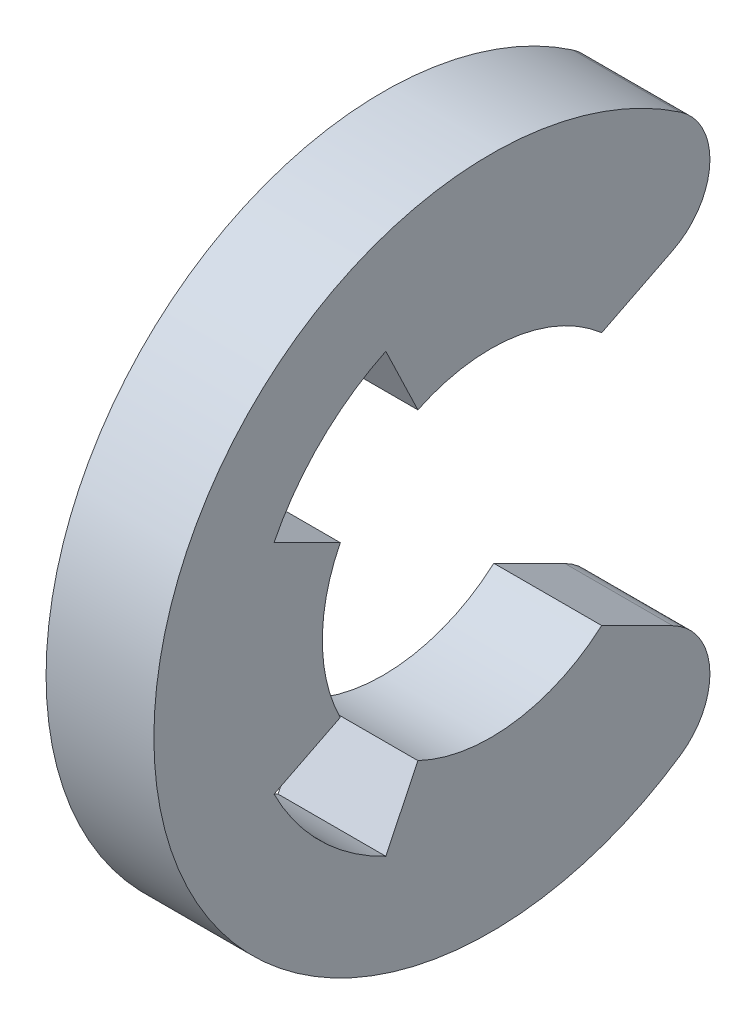
ISO-10303-21;
HEADER;
FILE_DESCRIPTION(('STEP AP214'),'2;1');
FILE_NAME('part.step','',(''),(''),'','','');
FILE_SCHEMA(('AUTOMOTIVE_DESIGN { 1 0 10303 214 1 1 1 1 }'));
ENDSEC;
DATA;
#1=APPLICATION_CONTEXT('core data for automotive mechanical design processes');
#2=APPLICATION_PROTOCOL_DEFINITION('international standard','automotive_design',2000,#1);
#3=PRODUCT_CONTEXT('',#1,'mechanical');
#4=PRODUCT('Part','Part','',(#3));
#5=PRODUCT_RELATED_PRODUCT_CATEGORY('part','',(#4));
#6=PRODUCT_DEFINITION_FORMATION('','',#4);
#7=PRODUCT_DEFINITION_CONTEXT('part definition',#1,'design');
#8=PRODUCT_DEFINITION('design','',#6,#7);
#9=PRODUCT_DEFINITION_SHAPE('','',#8);
#10=(LENGTH_UNIT() NAMED_UNIT(*) SI_UNIT(.MILLI.,.METRE.));
#11=(NAMED_UNIT(*) PLANE_ANGLE_UNIT() SI_UNIT($,.RADIAN.));
#12=(NAMED_UNIT(*) SI_UNIT($,.STERADIAN.) SOLID_ANGLE_UNIT());
#13=UNCERTAINTY_MEASURE_WITH_UNIT(LENGTH_MEASURE(1.E-05),#10,'distance_accuracy_value','');
#14=(GEOMETRIC_REPRESENTATION_CONTEXT(3) GLOBAL_UNCERTAINTY_ASSIGNED_CONTEXT((#13)) GLOBAL_UNIT_ASSIGNED_CONTEXT((#10,
#11,#12)) REPRESENTATION_CONTEXT('',''));
#15=CARTESIAN_POINT('',(0.,0.,0.));
#16=DIRECTION('',(0.,0.,1.));
#17=DIRECTION('',(1.,0.,0.));
#18=AXIS2_PLACEMENT_3D('',#15,#16,#17);
#19=CARTESIAN_POINT('',(0.8,0.,0.));
#20=DIRECTION('',(-1.,0.,0.));
#21=DIRECTION('',(0.,0.,1.));
#22=AXIS2_PLACEMENT_3D('',#19,#20,#21);
#23=CYLINDRICAL_SURFACE('',#22,1.25);
#24=CARTESIAN_POINT('',(0.,0.,0.));
#25=DIRECTION('',(-1.,0.,0.));
#26=DIRECTION('',(0.,0.,-1.));
#27=AXIS2_PLACEMENT_3D('',#24,#25,#26);
#28=CIRCLE('',#27,1.25);
#29=CARTESIAN_POINT('',(0.,-0.940873030296505,-0.822956828066134));
#30=VERTEX_POINT('',#29);
#31=CARTESIAN_POINT('',(0.,-1.12692770086044,0.54086408369701));
#32=VERTEX_POINT('',#31);
#33=EDGE_CURVE('E166',#30,#32,#28,.T.);
#34=ORIENTED_EDGE('',*,*,#33,.T.);
#35=DIRECTION('',(-1.,0.,0.));
#36=VECTOR('',#35,1.);
#37=CARTESIAN_POINT('',(0.8,-1.12692770086044,0.54086408369701));
#38=LINE('',#37,#36);
#39=CARTESIAN_POINT('',(0.8,-1.12692770086044,0.54086408369701));
#40=VERTEX_POINT('',#39);
#41=EDGE_CURVE('E149',#40,#32,#38,.T.);
#42=ORIENTED_EDGE('',*,*,#41,.F.);
#43=CARTESIAN_POINT('',(0.8,0.,0.));
#44=DIRECTION('',(-1.,0.,0.));
#45=DIRECTION('',(0.,0.,-1.));
#46=AXIS2_PLACEMENT_3D('',#43,#44,#45);
#47=CIRCLE('',#46,1.25);
#48=CARTESIAN_POINT('',(0.8,-0.940873030296505,-0.822956828066134));
#49=VERTEX_POINT('',#48);
#50=EDGE_CURVE('E155',#49,#40,#47,.T.);
#51=ORIENTED_EDGE('',*,*,#50,.F.);
#52=DIRECTION('',(-1.,0.,0.));
#53=VECTOR('',#52,1.);
#54=CARTESIAN_POINT('',(0.8,-0.940873030296505,-0.822956828066134));
#55=LINE('',#54,#53);
#56=EDGE_CURVE('E213',#49,#30,#55,.T.);
#57=ORIENTED_EDGE('',*,*,#56,.T.);
#58=EDGE_LOOP('',(#34,#42,#51,#57));
#59=FACE_BOUND('',#58,.T.);
#60=ADVANCED_FACE('F41',(#59),#23,.F.);
#61=CARTESIAN_POINT('',(0.8,-1.12692770086044,0.54086408369701));
#62=DIRECTION('',(0.,-0.432691266957608,-0.901542160688351));
#63=DIRECTION('',(0.,0.901542160688351,-0.432691266957608));
#64=AXIS2_PLACEMENT_3D('',#61,#62,#63);
#65=PLANE('',#64);
#66=DIRECTION('',(0.,-0.901542160688351,0.432691266957608));
#67=VECTOR('',#66,1.);
#68=CARTESIAN_POINT('',(0.,-1.12692770086044,0.54086408369701));
#69=LINE('',#68,#67);
#70=CARTESIAN_POINT('',(0.,-1.62277588923903,0.778844280523694));
#71=VERTEX_POINT('',#70);
#72=EDGE_CURVE('E248',#32,#71,#69,.T.);
#73=ORIENTED_EDGE('',*,*,#72,.T.);
#74=DIRECTION('',(-1.,0.,0.));
#75=VECTOR('',#74,1.);
#76=CARTESIAN_POINT('',(0.8,-1.62277588923903,0.778844280523694));
#77=LINE('',#76,#75);
#78=CARTESIAN_POINT('',(0.8,-1.62277588923903,0.778844280523694));
#79=VERTEX_POINT('',#78);
#80=EDGE_CURVE('E152',#79,#71,#77,.T.);
#81=ORIENTED_EDGE('',*,*,#80,.F.);
#82=DIRECTION('',(0.,-0.901542160688351,0.432691266957608));
#83=VECTOR('',#82,1.);
#84=CARTESIAN_POINT('',(0.8,-1.12692770086044,0.54086408369701));
#85=LINE('',#84,#83);
#86=EDGE_CURVE('E145',#40,#79,#85,.T.);
#87=ORIENTED_EDGE('',*,*,#86,.F.);
#88=ORIENTED_EDGE('',*,*,#41,.T.);
#89=EDGE_LOOP('',(#73,#81,#87,#88));
#90=FACE_BOUND('',#89,.T.);
#91=ADVANCED_FACE('F147',(#90),#65,.F.);
#92=CARTESIAN_POINT('',(0.8,0.,0.));
#93=DIRECTION('',(-1.,0.,0.));
#94=DIRECTION('',(0.,0.,1.));
#95=AXIS2_PLACEMENT_3D('',#92,#93,#94);
#96=CYLINDRICAL_SURFACE('',#95,1.8);
#97=CARTESIAN_POINT('',(0.,0.,0.));
#98=DIRECTION('',(-1.,0.,0.));
#99=DIRECTION('',(0.,0.,1.));
#100=AXIS2_PLACEMENT_3D('',#97,#98,#99);
#101=CIRCLE('',#100,1.8);
#102=CARTESIAN_POINT('',(0.,-0.808758973686157,1.60807615568483));
#103=VERTEX_POINT('',#102);
#104=EDGE_CURVE('E242',#71,#103,#101,.T.);
#105=ORIENTED_EDGE('',*,*,#104,.T.);
#106=DIRECTION('',(-1.,0.,0.));
#107=VECTOR('',#106,1.);
#108=CARTESIAN_POINT('',(0.8,-0.808758973686157,1.60807615568483));
#109=LINE('',#108,#107);
#110=CARTESIAN_POINT('',(0.8,-0.808758973686157,1.60807615568483));
#111=VERTEX_POINT('',#110);
#112=EDGE_CURVE('E171',#111,#103,#109,.T.);
#113=ORIENTED_EDGE('',*,*,#112,.F.);
#114=CARTESIAN_POINT('',(0.8,0.,0.));
#115=DIRECTION('',(-1.,0.,0.));
#116=DIRECTION('',(0.,0.,1.));
#117=AXIS2_PLACEMENT_3D('',#114,#115,#116);
#118=CIRCLE('',#117,1.8);
#119=EDGE_CURVE('E154',#79,#111,#118,.T.);
#120=ORIENTED_EDGE('',*,*,#119,.F.);
#121=ORIENTED_EDGE('',*,*,#80,.T.);
#122=EDGE_LOOP('',(#105,#113,#120,#121));
#123=FACE_BOUND('',#122,.T.);
#124=ADVANCED_FACE('F273',(#123),#96,.F.);
#125=CARTESIAN_POINT('',(0.8,-0.561638176170942,1.11671955255891));
#126=DIRECTION('',(0.,0.89337564204713,0.449310540936753));
#127=DIRECTION('',(0.,-0.449310540936753,0.89337564204713));
#128=AXIS2_PLACEMENT_3D('',#125,#126,#127);
#129=PLANE('',#128);
#130=DIRECTION('',(0.,0.449310540936753,-0.89337564204713));
#131=VECTOR('',#130,1.);
#132=CARTESIAN_POINT('',(0.,-0.561638176170942,1.11671955255891));
#133=LINE('',#132,#131);
#134=CARTESIAN_POINT('',(0.,-0.561638176170942,1.11671955255891));
#135=VERTEX_POINT('',#134);
#136=EDGE_CURVE('E237',#103,#135,#133,.T.);
#137=ORIENTED_EDGE('',*,*,#136,.T.);
#138=DIRECTION('',(-1.,0.,0.));
#139=VECTOR('',#138,1.);
#140=CARTESIAN_POINT('',(0.8,-0.561638176170942,1.11671955255891));
#141=LINE('',#140,#139);
#142=CARTESIAN_POINT('',(0.8,-0.561638176170942,1.11671955255891));
#143=VERTEX_POINT('',#142);
#144=EDGE_CURVE('E228',#143,#135,#141,.T.);
#145=ORIENTED_EDGE('',*,*,#144,.F.);
#146=DIRECTION('',(0.,0.449310540936753,-0.89337564204713));
#147=VECTOR('',#146,1.);
#148=CARTESIAN_POINT('',(0.8,-0.561638176170942,1.11671955255891));
#149=LINE('',#148,#147);
#150=EDGE_CURVE('E238',#111,#143,#149,.T.);
#151=ORIENTED_EDGE('',*,*,#150,.F.);
#152=ORIENTED_EDGE('',*,*,#112,.T.);
#153=EDGE_LOOP('',(#137,#145,#151,#152));
#154=FACE_BOUND('',#153,.T.);
#155=ADVANCED_FACE('F235',(#154),#129,.F.);
#156=CARTESIAN_POINT('',(0.8,0.,0.));
#157=DIRECTION('',(-1.,0.,0.));
#158=DIRECTION('',(0.,0.,1.));
#159=AXIS2_PLACEMENT_3D('',#156,#157,#158);
#160=CYLINDRICAL_SURFACE('',#159,1.25);
#161=CARTESIAN_POINT('',(0.,0.,0.));
#162=DIRECTION('',(-1.,0.,0.));
#163=DIRECTION('',(0.,0.,-1.));
#164=AXIS2_PLACEMENT_3D('',#161,#162,#163);
#165=CIRCLE('',#164,1.25);
#166=CARTESIAN_POINT('',(0.,0.561638176170941,1.11671955255891));
#167=VERTEX_POINT('',#166);
#168=EDGE_CURVE('E244',#135,#167,#165,.T.);
#169=ORIENTED_EDGE('',*,*,#168,.T.);
#170=DIRECTION('',(-1.,0.,0.));
#171=VECTOR('',#170,1.);
#172=CARTESIAN_POINT('',(0.8,0.561638176170941,1.11671955255891));
#173=LINE('',#172,#171);
#174=CARTESIAN_POINT('',(0.8,0.561638176170941,1.11671955255891));
#175=VERTEX_POINT('',#174);
#176=EDGE_CURVE('E225',#175,#167,#173,.T.);
#177=ORIENTED_EDGE('',*,*,#176,.F.);
#178=CARTESIAN_POINT('',(0.8,0.,0.));
#179=DIRECTION('',(-1.,0.,0.));
#180=DIRECTION('',(0.,0.,-1.));
#181=AXIS2_PLACEMENT_3D('',#178,#179,#180);
#182=CIRCLE('',#181,1.25);
#183=EDGE_CURVE('E275',#143,#175,#182,.T.);
#184=ORIENTED_EDGE('',*,*,#183,.F.);
#185=ORIENTED_EDGE('',*,*,#144,.T.);
#186=EDGE_LOOP('',(#169,#177,#184,#185));
#187=FACE_BOUND('',#186,.T.);
#188=ADVANCED_FACE('F290',(#187),#160,.F.);
#189=CARTESIAN_POINT('',(0.8,0.561638176170942,1.11671955255891));
#190=DIRECTION('',(0.,-0.89337564204713,0.449310540936753));
#191=DIRECTION('',(0.,-0.449310540936753,-0.89337564204713));
#192=AXIS2_PLACEMENT_3D('',#189,#190,#191);
#193=PLANE('',#192);
#194=DIRECTION('',(0.,0.449310540936753,0.89337564204713));
#195=VECTOR('',#194,1.);
#196=CARTESIAN_POINT('',(0.,0.561638176170942,1.11671955255891));
#197=LINE('',#196,#195);
#198=CARTESIAN_POINT('',(0.,0.808758973686156,1.60807615568483));
#199=VERTEX_POINT('',#198);
#200=EDGE_CURVE('E246',#167,#199,#197,.T.);
#201=ORIENTED_EDGE('',*,*,#200,.T.);
#202=DIRECTION('',(-1.,0.,0.));
#203=VECTOR('',#202,1.);
#204=CARTESIAN_POINT('',(0.8,0.808758973686156,1.60807615568483));
#205=LINE('',#204,#203);
#206=CARTESIAN_POINT('',(0.8,0.808758973686156,1.60807615568483));
#207=VERTEX_POINT('',#206);
#208=EDGE_CURVE('E222',#207,#199,#205,.T.);
#209=ORIENTED_EDGE('',*,*,#208,.F.);
#210=DIRECTION('',(0.,0.449310540936753,0.89337564204713));
#211=VECTOR('',#210,1.);
#212=CARTESIAN_POINT('',(0.8,0.561638176170942,1.11671955255891));
#213=LINE('',#212,#211);
#214=EDGE_CURVE('E279',#175,#207,#213,.T.);
#215=ORIENTED_EDGE('',*,*,#214,.F.);
#216=ORIENTED_EDGE('',*,*,#176,.T.);
#217=EDGE_LOOP('',(#201,#209,#215,#216));
#218=FACE_BOUND('',#217,.T.);
#219=ADVANCED_FACE('F286',(#218),#193,.F.);
#220=CARTESIAN_POINT('',(0.8,0.,0.));
#221=DIRECTION('',(-1.,0.,0.));
#222=DIRECTION('',(0.,0.,1.));
#223=AXIS2_PLACEMENT_3D('',#220,#221,#222);
#224=CYLINDRICAL_SURFACE('',#223,1.8);
#225=CARTESIAN_POINT('',(0.,0.,0.));
#226=DIRECTION('',(-1.,0.,0.));
#227=DIRECTION('',(0.,0.,-1.));
#228=AXIS2_PLACEMENT_3D('',#225,#226,#227);
#229=CIRCLE('',#228,1.8);
#230=CARTESIAN_POINT('',(0.,1.62277588923903,0.778844280523694));
#231=VERTEX_POINT('',#230);
#232=EDGE_CURVE('E253',#199,#231,#229,.T.);
#233=ORIENTED_EDGE('',*,*,#232,.T.);
#234=DIRECTION('',(-1.,0.,0.));
#235=VECTOR('',#234,1.);
#236=CARTESIAN_POINT('',(0.8,1.62277588923903,0.778844280523694));
#237=LINE('',#236,#235);
#238=CARTESIAN_POINT('',(0.8,1.62277588923903,0.778844280523694));
#239=VERTEX_POINT('',#238);
#240=EDGE_CURVE('E219',#239,#231,#237,.T.);
#241=ORIENTED_EDGE('',*,*,#240,.F.);
#242=CARTESIAN_POINT('',(0.8,0.,0.));
#243=DIRECTION('',(-1.,0.,0.));
#244=DIRECTION('',(0.,0.,-1.));
#245=AXIS2_PLACEMENT_3D('',#242,#243,#244);
#246=CIRCLE('',#245,1.8);
#247=EDGE_CURVE('E268',#207,#239,#246,.T.);
#248=ORIENTED_EDGE('',*,*,#247,.F.);
#249=ORIENTED_EDGE('',*,*,#208,.T.);
#250=EDGE_LOOP('',(#233,#241,#248,#249));
#251=FACE_BOUND('',#250,.T.);
#252=ADVANCED_FACE('F284',(#251),#224,.F.);
#253=CARTESIAN_POINT('',(0.8,1.12692770086044,0.54086408369701));
#254=DIRECTION('',(0.,0.432691266957608,-0.901542160688351));
#255=DIRECTION('',(0.,0.901542160688351,0.432691266957608));
#256=AXIS2_PLACEMENT_3D('',#253,#254,#255);
#257=PLANE('',#256);
#258=DIRECTION('',(0.,-0.901542160688351,-0.432691266957608));
#259=VECTOR('',#258,1.);
#260=CARTESIAN_POINT('',(0.,1.12692770086044,0.54086408369701));
#261=LINE('',#260,#259);
#262=CARTESIAN_POINT('',(0.,1.12692770086044,0.54086408369701));
#263=VERTEX_POINT('',#262);
#264=EDGE_CURVE('E208',#231,#263,#261,.T.);
#265=ORIENTED_EDGE('',*,*,#264,.T.);
#266=DIRECTION('',(-1.,0.,0.));
#267=VECTOR('',#266,1.);
#268=CARTESIAN_POINT('',(0.8,1.12692770086044,0.54086408369701));
#269=LINE('',#268,#267);
#270=CARTESIAN_POINT('',(0.8,1.12692770086044,0.54086408369701));
#271=VERTEX_POINT('',#270);
#272=EDGE_CURVE('E216',#271,#263,#269,.T.);
#273=ORIENTED_EDGE('',*,*,#272,.F.);
#274=DIRECTION('',(0.,-0.901542160688351,-0.432691266957608));
#275=VECTOR('',#274,1.);
#276=CARTESIAN_POINT('',(0.8,1.12692770086044,0.54086408369701));
#277=LINE('',#276,#275);
#278=EDGE_CURVE('E265',#239,#271,#277,.T.);
#279=ORIENTED_EDGE('',*,*,#278,.F.);
#280=ORIENTED_EDGE('',*,*,#240,.T.);
#281=EDGE_LOOP('',(#265,#273,#279,#280));
#282=FACE_BOUND('',#281,.T.);
#283=ADVANCED_FACE('F257',(#282),#257,.F.);
#284=CARTESIAN_POINT('',(0.8,0.,0.));
#285=DIRECTION('',(-1.,0.,0.));
#286=DIRECTION('',(0.,0.,1.));
#287=AXIS2_PLACEMENT_3D('',#284,#285,#286);
#288=CYLINDRICAL_SURFACE('',#287,1.25);
#289=CARTESIAN_POINT('',(0.,0.,0.));
#290=DIRECTION('',(-1.,0.,0.));
#291=DIRECTION('',(0.,0.,1.));
#292=AXIS2_PLACEMENT_3D('',#289,#290,#291);
#293=CIRCLE('',#292,1.25);
#294=CARTESIAN_POINT('',(0.,0.940873030296505,-0.822956828066133));
#295=VERTEX_POINT('',#294);
#296=EDGE_CURVE('E205',#263,#295,#293,.T.);
#297=ORIENTED_EDGE('',*,*,#296,.T.);
#298=DIRECTION('',(-1.,0.,0.));
#299=VECTOR('',#298,1.);
#300=CARTESIAN_POINT('',(0.8,0.940873030296505,-0.822956828066133));
#301=LINE('',#300,#299);
#302=CARTESIAN_POINT('',(0.8,0.940873030296505,-0.822956828066133));
#303=VERTEX_POINT('',#302);
#304=EDGE_CURVE('E204',#303,#295,#301,.T.);
#305=ORIENTED_EDGE('',*,*,#304,.F.);
#306=CARTESIAN_POINT('',(0.8,0.,0.));
#307=DIRECTION('',(-1.,0.,0.));
#308=DIRECTION('',(0.,0.,1.));
#309=AXIS2_PLACEMENT_3D('',#306,#307,#308);
#310=CIRCLE('',#309,1.25);
#311=EDGE_CURVE('E264',#271,#303,#310,.T.);
#312=ORIENTED_EDGE('',*,*,#311,.F.);
#313=ORIENTED_EDGE('',*,*,#272,.T.);
#314=EDGE_LOOP('',(#297,#305,#312,#313));
#315=FACE_BOUND('',#314,.T.);
#316=ADVANCED_FACE('F263',(#315),#288,.F.);
#317=CARTESIAN_POINT('',(0.8,0.940873030296505,-0.822956828066134));
#318=DIRECTION('',(0.,0.893578628582333,0.448906710287247));
#319=DIRECTION('',(0.,-0.448906710287247,0.893578628582333));
#320=AXIS2_PLACEMENT_3D('',#317,#318,#319);
#321=PLANE('',#320);
#322=DIRECTION('',(0.,0.448906710287247,-0.893578628582332));
#323=VECTOR('',#322,1.);
#324=CARTESIAN_POINT('',(0.,0.940873030296505,-0.822956828066134));
#325=LINE('',#324,#323);
#326=CARTESIAN_POINT('',(0.,1.2059787125082,-1.35066730000034));
#327=VERTEX_POINT('',#326);
#328=EDGE_CURVE('E199',#295,#327,#325,.T.);
#329=ORIENTED_EDGE('',*,*,#328,.T.);
#330=DIRECTION('',(-1.,0.,0.));
#331=VECTOR('',#330,1.);
#332=CARTESIAN_POINT('',(0.8,1.2059787125082,-1.35066730000034));
#333=LINE('',#332,#331);
#334=CARTESIAN_POINT('',(0.8,1.2059787125082,-1.35066730000034));
#335=VERTEX_POINT('',#334);
#336=EDGE_CURVE('E64',#327,#335,#333,.F.);
#337=ORIENTED_EDGE('',*,*,#336,.T.);
#338=DIRECTION('',(0.,0.448906710287247,-0.893578628582332));
#339=VECTOR('',#338,1.);
#340=CARTESIAN_POINT('',(0.8,0.940873030296505,-0.822956828066134));
#341=LINE('',#340,#339);
#342=EDGE_CURVE('E185',#303,#335,#341,.T.);
#343=ORIENTED_EDGE('',*,*,#342,.F.);
#344=ORIENTED_EDGE('',*,*,#304,.T.);
#345=EDGE_LOOP('',(#329,#337,#343,#344));
#346=FACE_BOUND('',#345,.T.);
#347=ADVANCED_FACE('F202',(#346),#321,.F.);
#348=CARTESIAN_POINT('',(0.8,0.,0.));
#349=DIRECTION('',(-1.,0.,0.));
#350=DIRECTION('',(0.,0.,1.));
#351=AXIS2_PLACEMENT_3D('',#348,#349,#350);
#352=CYLINDRICAL_SURFACE('',#351,2.5);
#353=CARTESIAN_POINT('',(0.8,0.,0.));
#354=DIRECTION('',(1.,0.,0.));
#355=DIRECTION('',(0.,0.,1.));
#356=AXIS2_PLACEMENT_3D('',#353,#354,#355);
#357=CIRCLE('',#356,2.5);
#358=CARTESIAN_POINT('',(0.8,2.06596003349921,-1.40776743107089));
#359=VERTEX_POINT('',#358);
#360=CARTESIAN_POINT('',(0.8,-2.06596003349921,-1.40776743107089));
#361=VERTEX_POINT('',#360);
#362=EDGE_CURVE('E184',#359,#361,#357,.T.);
#363=ORIENTED_EDGE('',*,*,#362,.F.);
#364=DIRECTION('',(-1.,0.,0.));
#365=VECTOR('',#364,1.);
#366=CARTESIAN_POINT('',(0.8,2.06596003349921,-1.40776743107089));
#367=LINE('',#366,#365);
#368=CARTESIAN_POINT('',(0.,2.06596003349921,-1.40776743107089));
#369=VERTEX_POINT('',#368);
#370=EDGE_CURVE('E169',#359,#369,#367,.T.);
#371=ORIENTED_EDGE('',*,*,#370,.T.);
#372=CARTESIAN_POINT('',(0.,0.,0.));
#373=DIRECTION('',(1.,0.,0.));
#374=DIRECTION('',(0.,0.,1.));
#375=AXIS2_PLACEMENT_3D('',#372,#373,#374);
#376=CIRCLE('',#375,2.5);
#377=CARTESIAN_POINT('',(0.,-2.06596003349921,-1.40776743107089));
#378=VERTEX_POINT('',#377);
#379=EDGE_CURVE('E200',#369,#378,#376,.T.);
#380=ORIENTED_EDGE('',*,*,#379,.T.);
#381=DIRECTION('',(-1.,0.,0.));
#382=VECTOR('',#381,1.);
#383=CARTESIAN_POINT('',(0.8,-2.06596003349921,-1.40776743107089));
#384=LINE('',#383,#382);
#385=EDGE_CURVE('E167',#378,#361,#384,.F.);
#386=ORIENTED_EDGE('',*,*,#385,.T.);
#387=EDGE_LOOP('',(#363,#371,#380,#386));
#388=FACE_BOUND('',#387,.T.);
#389=ADVANCED_FACE('F189',(#388),#352,.T.);
#390=CARTESIAN_POINT('',(0.8,-0.940873030296505,-0.822956828066134));
#391=DIRECTION('',(0.,-0.893578628582333,0.448906710287247));
#392=DIRECTION('',(0.,-0.448906710287247,-0.893578628582333));
#393=AXIS2_PLACEMENT_3D('',#390,#391,#392);
#394=PLANE('',#393);
#395=DIRECTION('',(0.,0.448906710287247,0.893578628582332));
#396=VECTOR('',#395,1.);
#397=CARTESIAN_POINT('',(0.8,-0.940873030296505,-0.822956828066134));
#398=LINE('',#397,#396);
#399=CARTESIAN_POINT('',(0.8,-1.2059787125082,-1.35066730000034));
#400=VERTEX_POINT('',#399);
#401=EDGE_CURVE('E159',#400,#49,#398,.T.);
#402=ORIENTED_EDGE('',*,*,#401,.F.);
#403=DIRECTION('',(-1.,0.,0.));
#404=VECTOR('',#403,1.);
#405=CARTESIAN_POINT('',(0.8,-1.2059787125082,-1.35066730000034));
#406=LINE('',#405,#404);
#407=CARTESIAN_POINT('',(0.,-1.2059787125082,-1.35066730000034));
#408=VERTEX_POINT('',#407);
#409=EDGE_CURVE('E11',#400,#408,#406,.T.);
#410=ORIENTED_EDGE('',*,*,#409,.T.);
#411=DIRECTION('',(0.,0.448906710287247,0.893578628582332));
#412=VECTOR('',#411,1.);
#413=CARTESIAN_POINT('',(0.,-0.940873030296505,-0.822956828066134));
#414=LINE('',#413,#412);
#415=EDGE_CURVE('E163',#408,#30,#414,.T.);
#416=ORIENTED_EDGE('',*,*,#415,.T.);
#417=ORIENTED_EDGE('',*,*,#56,.F.);
#418=EDGE_LOOP('',(#402,#410,#416,#417));
#419=FACE_BOUND('',#418,.T.);
#420=ADVANCED_FACE('F316',(#419),#394,.F.);
#421=CARTESIAN_POINT('',(0.8,0.,0.));
#422=DIRECTION('',(1.,0.,0.));
#423=DIRECTION('',(0.,0.,-1.));
#424=AXIS2_PLACEMENT_3D('',#421,#422,#423);
#425=PLANE('',#424);
#426=ORIENTED_EDGE('',*,*,#342,.T.);
#427=CARTESIAN_POINT('',(0.8,1.65276802679937,-1.12621394485671));
#428=DIRECTION('',(1.,0.,0.));
#429=DIRECTION('',(0.,0.,-1.));
#430=AXIS2_PLACEMENT_3D('',#427,#428,#429);
#431=CIRCLE('',#430,0.5);
#432=EDGE_CURVE('E49',#335,#359,#431,.T.);
#433=ORIENTED_EDGE('',*,*,#432,.T.);
#434=ORIENTED_EDGE('',*,*,#362,.T.);
#435=CARTESIAN_POINT('',(0.8,-1.65276802679937,-1.12621394485671));
#436=DIRECTION('',(1.,0.,0.));
#437=DIRECTION('',(0.,0.,-1.));
#438=AXIS2_PLACEMENT_3D('',#435,#436,#437);
#439=CIRCLE('',#438,0.5);
#440=EDGE_CURVE('E56',#361,#400,#439,.T.);
#441=ORIENTED_EDGE('',*,*,#440,.T.);
#442=ORIENTED_EDGE('',*,*,#401,.T.);
#443=ORIENTED_EDGE('',*,*,#50,.T.);
#444=ORIENTED_EDGE('',*,*,#86,.T.);
#445=ORIENTED_EDGE('',*,*,#119,.T.);
#446=ORIENTED_EDGE('',*,*,#150,.T.);
#447=ORIENTED_EDGE('',*,*,#183,.T.);
#448=ORIENTED_EDGE('',*,*,#214,.T.);
#449=ORIENTED_EDGE('',*,*,#247,.T.);
#450=ORIENTED_EDGE('',*,*,#278,.T.);
#451=ORIENTED_EDGE('',*,*,#311,.T.);
#452=EDGE_LOOP('',(#426,#433,#434,#441,#442,#443,#444,#445,#446,#447,#448,#449,#450,#451));
#453=FACE_BOUND('',#452,.T.);
#454=ADVANCED_FACE('F158',(#453),#425,.T.);
#455=CARTESIAN_POINT('',(0.,0.,0.));
#456=DIRECTION('',(1.,0.,0.));
#457=DIRECTION('',(0.,0.,-1.));
#458=AXIS2_PLACEMENT_3D('',#455,#456,#457);
#459=PLANE('',#458);
#460=ORIENTED_EDGE('',*,*,#379,.F.);
#461=CARTESIAN_POINT('',(0.,1.65276802679937,-1.12621394485671));
#462=DIRECTION('',(1.,0.,0.));
#463=DIRECTION('',(0.,0.,-1.));
#464=AXIS2_PLACEMENT_3D('',#461,#462,#463);
#465=CIRCLE('',#464,0.5);
#466=EDGE_CURVE('E179',#369,#327,#465,.F.);
#467=ORIENTED_EDGE('',*,*,#466,.T.);
#468=ORIENTED_EDGE('',*,*,#328,.F.);
#469=ORIENTED_EDGE('',*,*,#296,.F.);
#470=ORIENTED_EDGE('',*,*,#264,.F.);
#471=ORIENTED_EDGE('',*,*,#232,.F.);
#472=ORIENTED_EDGE('',*,*,#200,.F.);
#473=ORIENTED_EDGE('',*,*,#168,.F.);
#474=ORIENTED_EDGE('',*,*,#136,.F.);
#475=ORIENTED_EDGE('',*,*,#104,.F.);
#476=ORIENTED_EDGE('',*,*,#72,.F.);
#477=ORIENTED_EDGE('',*,*,#33,.F.);
#478=ORIENTED_EDGE('',*,*,#415,.F.);
#479=CARTESIAN_POINT('',(0.,-1.65276802679937,-1.12621394485671));
#480=DIRECTION('',(1.,0.,0.));
#481=DIRECTION('',(0.,0.,-1.));
#482=AXIS2_PLACEMENT_3D('',#479,#480,#481);
#483=CIRCLE('',#482,0.5);
#484=EDGE_CURVE('E177',#408,#378,#483,.F.);
#485=ORIENTED_EDGE('',*,*,#484,.T.);
#486=EDGE_LOOP('',(#460,#467,#468,#469,#470,#471,#472,#473,#474,#475,#476,#477,#478,#485));
#487=FACE_BOUND('',#486,.T.);
#488=ADVANCED_FACE('F197',(#487),#459,.F.);
#489=CARTESIAN_POINT('',(0.8,1.65276802679937,-1.12621394485671));
#490=DIRECTION('',(-1.,0.,0.));
#491=DIRECTION('',(0.,0.,1.));
#492=AXIS2_PLACEMENT_3D('',#489,#490,#491);
#493=CYLINDRICAL_SURFACE('',#492,0.5);
#494=ORIENTED_EDGE('',*,*,#432,.F.);
#495=ORIENTED_EDGE('',*,*,#336,.F.);
#496=ORIENTED_EDGE('',*,*,#466,.F.);
#497=ORIENTED_EDGE('',*,*,#370,.F.);
#498=EDGE_LOOP('',(#494,#495,#496,#497));
#499=FACE_BOUND('',#498,.T.);
#500=ADVANCED_FACE('F194',(#499),#493,.T.);
#501=CARTESIAN_POINT('',(0.8,-1.65276802679937,-1.12621394485671));
#502=DIRECTION('',(-1.,0.,0.));
#503=DIRECTION('',(0.,0.,1.));
#504=AXIS2_PLACEMENT_3D('',#501,#502,#503);
#505=CYLINDRICAL_SURFACE('',#504,0.5);
#506=ORIENTED_EDGE('',*,*,#440,.F.);
#507=ORIENTED_EDGE('',*,*,#385,.F.);
#508=ORIENTED_EDGE('',*,*,#484,.F.);
#509=ORIENTED_EDGE('',*,*,#409,.F.);
#510=EDGE_LOOP('',(#506,#507,#508,#509));
#511=FACE_BOUND('',#510,.T.);
#512=ADVANCED_FACE('F43',(#511),#505,.T.);
#513=CLOSED_SHELL('',(#60,#91,#124,#155,#188,#219,#252,#283,#316,#347,#389,#420,#454,#488,#500,#512));
#514=MANIFOLD_SOLID_BREP('B2',#513);
#515=ADVANCED_BREP_SHAPE_REPRESENTATION('',(#18,#514),#14);
#516=SHAPE_DEFINITION_REPRESENTATION(#9,#515);
ENDSEC;
END-ISO-10303-21;
